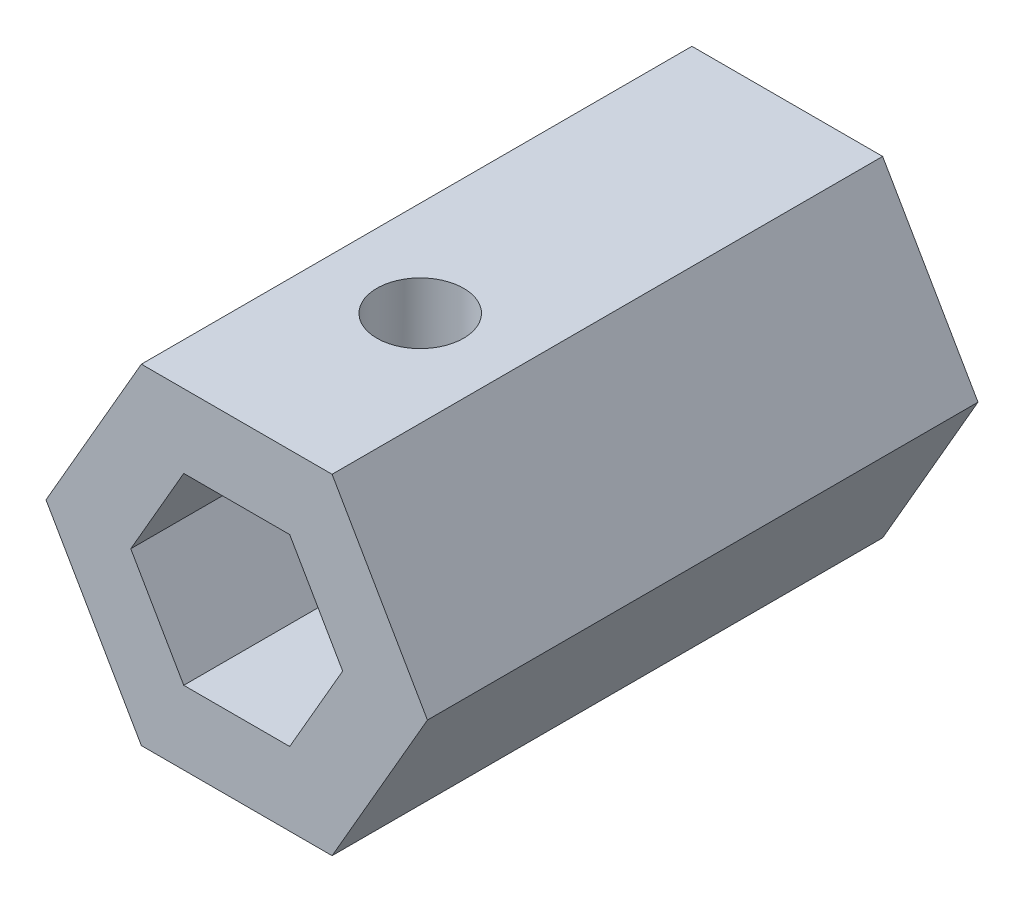
ISO-10303-21;
HEADER;
FILE_DESCRIPTION(('STEP AP214'),'2;1');
FILE_NAME('part.step','',(''),(''),'','','');
FILE_SCHEMA(('AUTOMOTIVE_DESIGN { 1 0 10303 214 1 1 1 1 }'));
ENDSEC;
DATA;
#1=APPLICATION_CONTEXT('core data for automotive mechanical design processes');
#2=APPLICATION_PROTOCOL_DEFINITION('international standard','automotive_design',2000,#1);
#3=PRODUCT_CONTEXT('',#1,'mechanical');
#4=PRODUCT('Part','Part','',(#3));
#5=PRODUCT_RELATED_PRODUCT_CATEGORY('part','',(#4));
#6=PRODUCT_DEFINITION_FORMATION('','',#4);
#7=PRODUCT_DEFINITION_CONTEXT('part definition',#1,'design');
#8=PRODUCT_DEFINITION('design','',#6,#7);
#9=PRODUCT_DEFINITION_SHAPE('','',#8);
#10=(LENGTH_UNIT() NAMED_UNIT(*) SI_UNIT(.MILLI.,.METRE.));
#11=(NAMED_UNIT(*) PLANE_ANGLE_UNIT() SI_UNIT($,.RADIAN.));
#12=(NAMED_UNIT(*) SI_UNIT($,.STERADIAN.) SOLID_ANGLE_UNIT());
#13=UNCERTAINTY_MEASURE_WITH_UNIT(LENGTH_MEASURE(1.E-05),#10,'distance_accuracy_value','');
#14=(GEOMETRIC_REPRESENTATION_CONTEXT(3) GLOBAL_UNCERTAINTY_ASSIGNED_CONTEXT((#13)) GLOBAL_UNIT_ASSIGNED_CONTEXT((#10,
#11,#12)) REPRESENTATION_CONTEXT('',''));
#15=CARTESIAN_POINT('',(0.,0.,0.));
#16=DIRECTION('',(0.,0.,1.));
#17=DIRECTION('',(1.,0.,0.));
#18=AXIS2_PLACEMENT_3D('',#15,#16,#17);
#19=CARTESIAN_POINT('',(0.,0.,0.));
#20=DIRECTION('',(0.,0.,1.));
#21=DIRECTION('',(1.,0.,0.));
#22=AXIS2_PLACEMENT_3D('',#19,#20,#21);
#23=PLANE('',#22);
#24=CARTESIAN_POINT('',(0.,0.,0.));
#25=DIRECTION('',(0.,0.,1.));
#26=DIRECTION('',(1.,0.,0.));
#27=AXIS2_PLACEMENT_3D('',#24,#25,#26);
#28=CIRCLE('',#27,2.2479);
#29=CARTESIAN_POINT('',(2.2479,0.,0.));
#30=VERTEX_POINT('',#29);
#31=EDGE_CURVE('E289',#30,#30,#28,.T.);
#32=ORIENTED_EDGE('',*,*,#31,.T.);
#33=EDGE_LOOP('',(#32));
#34=FACE_BOUND('',#33,.T.);
#35=CARTESIAN_POINT('',(0.,0.,0.));
#36=DIRECTION('',(0.,0.,-1.));
#37=DIRECTION('',(-1.,0.,0.));
#38=AXIS2_PLACEMENT_3D('',#35,#36,#37);
#39=CIRCLE('',#38,6.05);
#40=CARTESIAN_POINT('',(-6.05,0.,0.));
#41=VERTEX_POINT('',#40);
#42=EDGE_CURVE('E167',#41,#41,#39,.T.);
#43=ORIENTED_EDGE('',*,*,#42,.T.);
#44=EDGE_LOOP('',(#43));
#45=FACE_BOUND('',#44,.T.);
#46=ADVANCED_FACE('F51',(#34,#45),#23,.F.);
#47=CARTESIAN_POINT('',(9.89867036525614,-5.715,2.54));
#48=DIRECTION('',(-0.866025403784439,0.5,0.));
#49=DIRECTION('',(-0.5,-0.866025403784439,0.));
#50=AXIS2_PLACEMENT_3D('',#47,#48,#49);
#51=PLANE('',#50);
#52=DIRECTION('',(0.,0.,-1.));
#53=VECTOR('',#52,1.);
#54=CARTESIAN_POINT('',(6.59911357683742,-11.43,2.54));
#55=LINE('',#54,#53);
#56=CARTESIAN_POINT('',(6.59911357683742,-11.43,25.4));
#57=VERTEX_POINT('',#56);
#58=CARTESIAN_POINT('',(6.59911357683742,-11.43,-12.7));
#59=VERTEX_POINT('',#58);
#60=EDGE_CURVE('E149',#57,#59,#55,.T.);
#61=ORIENTED_EDGE('',*,*,#60,.T.);
#62=DIRECTION('',(-0.5,-0.866025403784439,0.));
#63=VECTOR('',#62,1.);
#64=CARTESIAN_POINT('',(13.1982271536748,0.,-12.7));
#65=LINE('',#64,#63);
#66=CARTESIAN_POINT('',(13.1982271536748,0.,-12.7));
#67=VERTEX_POINT('',#66);
#68=EDGE_CURVE('E148',#67,#59,#65,.T.);
#69=ORIENTED_EDGE('',*,*,#68,.F.);
#70=DIRECTION('',(0.,0.,-1.));
#71=VECTOR('',#70,1.);
#72=CARTESIAN_POINT('',(13.1982271536748,0.,2.54));
#73=LINE('',#72,#71);
#74=CARTESIAN_POINT('',(13.1982271536748,0.,25.4));
#75=VERTEX_POINT('',#74);
#76=EDGE_CURVE('E11',#75,#67,#73,.T.);
#77=ORIENTED_EDGE('',*,*,#76,.F.);
#78=DIRECTION('',(0.5,0.866025403784439,0.));
#79=VECTOR('',#78,1.);
#80=CARTESIAN_POINT('',(6.59911357683742,-11.43,25.4));
#81=LINE('',#80,#79);
#82=EDGE_CURVE('E259',#57,#75,#81,.T.);
#83=ORIENTED_EDGE('',*,*,#82,.F.);
#84=EDGE_LOOP('',(#61,#69,#77,#83));
#85=FACE_BOUND('',#84,.T.);
#86=ADVANCED_FACE('F53',(#85),#51,.F.);
#87=CARTESIAN_POINT('',(9.89867036525613,5.715,2.54));
#88=DIRECTION('',(-0.866025403784439,-0.5,0.));
#89=DIRECTION('',(0.5,-0.866025403784439,0.));
#90=AXIS2_PLACEMENT_3D('',#87,#88,#89);
#91=PLANE('',#90);
#92=ORIENTED_EDGE('',*,*,#76,.T.);
#93=DIRECTION('',(0.5,-0.866025403784439,0.));
#94=VECTOR('',#93,1.);
#95=CARTESIAN_POINT('',(6.59911357683742,11.43,-12.7));
#96=LINE('',#95,#94);
#97=CARTESIAN_POINT('',(6.59911357683742,11.43,-12.7));
#98=VERTEX_POINT('',#97);
#99=EDGE_CURVE('E141',#98,#67,#96,.T.);
#100=ORIENTED_EDGE('',*,*,#99,.F.);
#101=DIRECTION('',(0.,0.,-1.));
#102=VECTOR('',#101,1.);
#103=CARTESIAN_POINT('',(6.59911357683742,11.43,2.54));
#104=LINE('',#103,#102);
#105=CARTESIAN_POINT('',(6.59911357683742,11.43,25.4));
#106=VERTEX_POINT('',#105);
#107=EDGE_CURVE('E60',#106,#98,#104,.T.);
#108=ORIENTED_EDGE('',*,*,#107,.F.);
#109=DIRECTION('',(-0.5,0.866025403784439,0.));
#110=VECTOR('',#109,1.);
#111=CARTESIAN_POINT('',(13.1982271536748,0.,25.4));
#112=LINE('',#111,#110);
#113=EDGE_CURVE('E143',#75,#106,#112,.T.);
#114=ORIENTED_EDGE('',*,*,#113,.F.);
#115=EDGE_LOOP('',(#92,#100,#108,#114));
#116=FACE_BOUND('',#115,.T.);
#117=ADVANCED_FACE('F139',(#116),#91,.F.);
#118=CARTESIAN_POINT('',(0.,11.43,2.54));
#119=DIRECTION('',(0.,-1.,0.));
#120=DIRECTION('',(0.,0.,-1.));
#121=AXIS2_PLACEMENT_3D('',#118,#119,#120);
#122=PLANE('',#121);
#123=CARTESIAN_POINT('',(0.,11.43,12.7));
#124=DIRECTION('',(0.,1.,0.));
#125=DIRECTION('',(0.,0.,1.));
#126=AXIS2_PLACEMENT_3D('',#123,#124,#125);
#127=CIRCLE('',#126,3.);
#128=CARTESIAN_POINT('',(0.,11.43,15.7));
#129=VERTEX_POINT('',#128);
#130=EDGE_CURVE('E182',#129,#129,#127,.T.);
#131=ORIENTED_EDGE('',*,*,#130,.F.);
#132=EDGE_LOOP('',(#131));
#133=FACE_BOUND('',#132,.T.);
#134=ORIENTED_EDGE('',*,*,#107,.T.);
#135=DIRECTION('',(1.,0.,0.));
#136=VECTOR('',#135,1.);
#137=CARTESIAN_POINT('',(-6.59911357683742,11.43,-12.7));
#138=LINE('',#137,#136);
#139=CARTESIAN_POINT('',(-6.59911357683742,11.43,-12.7));
#140=VERTEX_POINT('',#139);
#141=EDGE_CURVE('E161',#140,#98,#138,.T.);
#142=ORIENTED_EDGE('',*,*,#141,.F.);
#143=DIRECTION('',(0.,0.,-1.));
#144=VECTOR('',#143,1.);
#145=CARTESIAN_POINT('',(-6.59911357683742,11.43,2.54));
#146=LINE('',#145,#144);
#147=CARTESIAN_POINT('',(-6.59911357683742,11.43,25.4));
#148=VERTEX_POINT('',#147);
#149=EDGE_CURVE('E301',#148,#140,#146,.T.);
#150=ORIENTED_EDGE('',*,*,#149,.F.);
#151=DIRECTION('',(-1.,0.,0.));
#152=VECTOR('',#151,1.);
#153=CARTESIAN_POINT('',(6.59911357683742,11.43,25.4));
#154=LINE('',#153,#152);
#155=EDGE_CURVE('E243',#106,#148,#154,.T.);
#156=ORIENTED_EDGE('',*,*,#155,.F.);
#157=EDGE_LOOP('',(#134,#142,#150,#156));
#158=FACE_BOUND('',#157,.T.);
#159=ADVANCED_FACE('F306',(#133,#158),#122,.F.);
#160=CARTESIAN_POINT('',(-9.89867036525613,5.715,2.54));
#161=DIRECTION('',(0.866025403784439,-0.5,0.));
#162=DIRECTION('',(0.5,0.866025403784439,0.));
#163=AXIS2_PLACEMENT_3D('',#160,#161,#162);
#164=PLANE('',#163);
#165=ORIENTED_EDGE('',*,*,#149,.T.);
#166=DIRECTION('',(0.5,0.866025403784439,0.));
#167=VECTOR('',#166,1.);
#168=CARTESIAN_POINT('',(-13.1982271536748,0.,-12.7));
#169=LINE('',#168,#167);
#170=CARTESIAN_POINT('',(-13.1982271536748,0.,-12.7));
#171=VERTEX_POINT('',#170);
#172=EDGE_CURVE('E177',#171,#140,#169,.T.);
#173=ORIENTED_EDGE('',*,*,#172,.F.);
#174=DIRECTION('',(0.,0.,-1.));
#175=VECTOR('',#174,1.);
#176=CARTESIAN_POINT('',(-13.1982271536748,0.,2.54));
#177=LINE('',#176,#175);
#178=CARTESIAN_POINT('',(-13.1982271536748,0.,25.4));
#179=VERTEX_POINT('',#178);
#180=EDGE_CURVE('E298',#179,#171,#177,.T.);
#181=ORIENTED_EDGE('',*,*,#180,.F.);
#182=DIRECTION('',(-0.5,-0.866025403784439,0.));
#183=VECTOR('',#182,1.);
#184=CARTESIAN_POINT('',(-6.59911357683742,11.43,25.4));
#185=LINE('',#184,#183);
#186=EDGE_CURVE('E247',#148,#179,#185,.T.);
#187=ORIENTED_EDGE('',*,*,#186,.F.);
#188=EDGE_LOOP('',(#165,#173,#181,#187));
#189=FACE_BOUND('',#188,.T.);
#190=ADVANCED_FACE('F320',(#189),#164,.F.);
#191=CARTESIAN_POINT('',(-9.89867036525613,-5.715,2.54));
#192=DIRECTION('',(0.866025403784439,0.5,0.));
#193=DIRECTION('',(-0.5,0.866025403784439,0.));
#194=AXIS2_PLACEMENT_3D('',#191,#192,#193);
#195=PLANE('',#194);
#196=ORIENTED_EDGE('',*,*,#180,.T.);
#197=DIRECTION('',(-0.5,0.866025403784439,0.));
#198=VECTOR('',#197,1.);
#199=CARTESIAN_POINT('',(-6.59911357683742,-11.43,-12.7));
#200=LINE('',#199,#198);
#201=CARTESIAN_POINT('',(-6.59911357683742,-11.43,-12.7));
#202=VERTEX_POINT('',#201);
#203=EDGE_CURVE('E173',#202,#171,#200,.T.);
#204=ORIENTED_EDGE('',*,*,#203,.F.);
#205=DIRECTION('',(0.,0.,-1.));
#206=VECTOR('',#205,1.);
#207=CARTESIAN_POINT('',(-6.59911357683742,-11.43,2.54));
#208=LINE('',#207,#206);
#209=CARTESIAN_POINT('',(-6.59911357683742,-11.43,25.4));
#210=VERTEX_POINT('',#209);
#211=EDGE_CURVE('E295',#210,#202,#208,.T.);
#212=ORIENTED_EDGE('',*,*,#211,.F.);
#213=DIRECTION('',(0.5,-0.866025403784439,0.));
#214=VECTOR('',#213,1.);
#215=CARTESIAN_POINT('',(-13.1982271536748,0.,25.4));
#216=LINE('',#215,#214);
#217=EDGE_CURVE('E251',#179,#210,#216,.T.);
#218=ORIENTED_EDGE('',*,*,#217,.F.);
#219=EDGE_LOOP('',(#196,#204,#212,#218));
#220=FACE_BOUND('',#219,.T.);
#221=ADVANCED_FACE('F318',(#220),#195,.F.);
#222=CARTESIAN_POINT('',(0.,-11.43,2.54));
#223=DIRECTION('',(0.,1.,0.));
#224=DIRECTION('',(0.,0.,1.));
#225=AXIS2_PLACEMENT_3D('',#222,#223,#224);
#226=PLANE('',#225);
#227=CARTESIAN_POINT('',(0.,-11.43,12.7));
#228=DIRECTION('',(0.,1.,0.));
#229=DIRECTION('',(0.,0.,1.));
#230=AXIS2_PLACEMENT_3D('',#227,#228,#229);
#231=CIRCLE('',#230,2.99999999999999);
#232=CARTESIAN_POINT('',(0.,-11.43,15.7));
#233=VERTEX_POINT('',#232);
#234=EDGE_CURVE('E186',#233,#233,#231,.T.);
#235=ORIENTED_EDGE('',*,*,#234,.T.);
#236=EDGE_LOOP('',(#235));
#237=FACE_BOUND('',#236,.T.);
#238=ORIENTED_EDGE('',*,*,#211,.T.);
#239=DIRECTION('',(-1.,0.,0.));
#240=VECTOR('',#239,1.);
#241=CARTESIAN_POINT('',(6.59911357683742,-11.43,-12.7));
#242=LINE('',#241,#240);
#243=EDGE_CURVE('E154',#59,#202,#242,.T.);
#244=ORIENTED_EDGE('',*,*,#243,.F.);
#245=ORIENTED_EDGE('',*,*,#60,.F.);
#246=DIRECTION('',(1.,0.,0.));
#247=VECTOR('',#246,1.);
#248=CARTESIAN_POINT('',(-6.59911357683742,-11.43,25.4));
#249=LINE('',#248,#247);
#250=EDGE_CURVE('E255',#210,#57,#249,.T.);
#251=ORIENTED_EDGE('',*,*,#250,.F.);
#252=EDGE_LOOP('',(#238,#244,#245,#251));
#253=FACE_BOUND('',#252,.T.);
#254=ADVANCED_FACE('F314',(#237,#253),#226,.F.);
#255=CARTESIAN_POINT('',(0.,0.,2.54));
#256=DIRECTION('',(0.,0.,1.));
#257=DIRECTION('',(1.,0.,0.));
#258=AXIS2_PLACEMENT_3D('',#255,#256,#257);
#259=PLANE('',#258);
#260=DIRECTION('',(-1.,0.,0.));
#261=VECTOR('',#260,1.);
#262=CARTESIAN_POINT('',(0.,-6.35,2.54));
#263=LINE('',#262,#261);
#264=CARTESIAN_POINT('',(3.66617420935413,-6.35,2.54));
#265=VERTEX_POINT('',#264);
#266=CARTESIAN_POINT('',(-3.66617420935412,-6.35,2.54));
#267=VERTEX_POINT('',#266);
#268=EDGE_CURVE('E67',#265,#267,#263,.T.);
#269=ORIENTED_EDGE('',*,*,#268,.F.);
#270=DIRECTION('',(-0.5,-0.866025403784439,0.));
#271=VECTOR('',#270,1.);
#272=CARTESIAN_POINT('',(5.49926131403119,-3.175,2.54));
#273=LINE('',#272,#271);
#274=CARTESIAN_POINT('',(7.33234841870825,0.,2.54));
#275=VERTEX_POINT('',#274);
#276=EDGE_CURVE('E71',#275,#265,#273,.T.);
#277=ORIENTED_EDGE('',*,*,#276,.F.);
#278=DIRECTION('',(0.5,-0.866025403784439,0.));
#279=VECTOR('',#278,1.);
#280=CARTESIAN_POINT('',(5.49926131403119,3.175,2.54));
#281=LINE('',#280,#279);
#282=CARTESIAN_POINT('',(3.66617420935412,6.35,2.54));
#283=VERTEX_POINT('',#282);
#284=EDGE_CURVE('E274',#283,#275,#281,.T.);
#285=ORIENTED_EDGE('',*,*,#284,.F.);
#286=DIRECTION('',(1.,0.,0.));
#287=VECTOR('',#286,1.);
#288=CARTESIAN_POINT('',(0.,6.35,2.54));
#289=LINE('',#288,#287);
#290=CARTESIAN_POINT('',(-3.66617420935412,6.35,2.54));
#291=VERTEX_POINT('',#290);
#292=EDGE_CURVE('E270',#291,#283,#289,.T.);
#293=ORIENTED_EDGE('',*,*,#292,.F.);
#294=DIRECTION('',(0.5,0.866025403784439,0.));
#295=VECTOR('',#294,1.);
#296=CARTESIAN_POINT('',(-5.49926131403118,3.175,2.54));
#297=LINE('',#296,#295);
#298=CARTESIAN_POINT('',(-7.33234841870825,0.,2.54));
#299=VERTEX_POINT('',#298);
#300=EDGE_CURVE('E266',#299,#291,#297,.T.);
#301=ORIENTED_EDGE('',*,*,#300,.F.);
#302=DIRECTION('',(-0.5,0.866025403784439,0.));
#303=VECTOR('',#302,1.);
#304=CARTESIAN_POINT('',(-5.49926131403119,-3.175,2.54));
#305=LINE('',#304,#303);
#306=EDGE_CURVE('E262',#267,#299,#305,.T.);
#307=ORIENTED_EDGE('',*,*,#306,.F.);
#308=EDGE_LOOP('',(#269,#277,#285,#293,#301,#307));
#309=FACE_BOUND('',#308,.T.);
#310=CARTESIAN_POINT('',(0.,0.,2.54));
#311=DIRECTION('',(0.,0.,1.));
#312=DIRECTION('',(1.,0.,0.));
#313=AXIS2_PLACEMENT_3D('',#310,#311,#312);
#314=CIRCLE('',#313,4.2164);
#315=CARTESIAN_POINT('',(4.2164,0.,2.54));
#316=VERTEX_POINT('',#315);
#317=EDGE_CURVE('E281',#316,#316,#314,.T.);
#318=ORIENTED_EDGE('',*,*,#317,.F.);
#319=EDGE_LOOP('',(#318));
#320=FACE_BOUND('',#319,.T.);
#321=ADVANCED_FACE('F340',(#309,#320),#259,.T.);
#322=CARTESIAN_POINT('',(0.,0.,2.54));
#323=DIRECTION('',(0.,0.,1.));
#324=DIRECTION('',(1.,0.,0.));
#325=AXIS2_PLACEMENT_3D('',#322,#323,#324);
#326=CYLINDRICAL_SURFACE('',#325,2.2479);
#327=ORIENTED_EDGE('',*,*,#31,.F.);
#328=EDGE_LOOP('',(#327));
#329=FACE_BOUND('',#328,.T.);
#330=CARTESIAN_POINT('',(0.,0.,0.888232376027522));
#331=DIRECTION('',(0.,0.,1.));
#332=DIRECTION('',(1.,0.,0.));
#333=AXIS2_PLACEMENT_3D('',#330,#331,#332);
#334=CIRCLE('',#333,2.2479);
#335=CARTESIAN_POINT('',(2.2479,0.,0.888232376027522));
#336=VERTEX_POINT('',#335);
#337=EDGE_CURVE('E285',#336,#336,#334,.T.);
#338=ORIENTED_EDGE('',*,*,#337,.T.);
#339=EDGE_LOOP('',(#338));
#340=FACE_BOUND('',#339,.T.);
#341=ADVANCED_FACE('F348',(#329,#340),#326,.F.);
#342=CARTESIAN_POINT('',(0.,0.,2.54));
#343=DIRECTION('',(0.,0.,1.));
#344=DIRECTION('',(1.,0.,0.));
#345=AXIS2_PLACEMENT_3D('',#342,#343,#344);
#346=CONICAL_SURFACE('',#345,4.2164,0.872664625997164);
#347=ORIENTED_EDGE('',*,*,#337,.F.);
#348=EDGE_LOOP('',(#347));
#349=FACE_BOUND('',#348,.T.);
#350=ORIENTED_EDGE('',*,*,#317,.T.);
#351=EDGE_LOOP('',(#350));
#352=FACE_BOUND('',#351,.T.);
#353=ADVANCED_FACE('F391',(#349,#352),#346,.F.);
#354=CARTESIAN_POINT('',(0.,0.,25.4));
#355=DIRECTION('',(0.,0.,1.));
#356=DIRECTION('',(1.,0.,0.));
#357=AXIS2_PLACEMENT_3D('',#354,#355,#356);
#358=PLANE('',#357);
#359=ORIENTED_EDGE('',*,*,#113,.T.);
#360=ORIENTED_EDGE('',*,*,#155,.T.);
#361=ORIENTED_EDGE('',*,*,#186,.T.);
#362=ORIENTED_EDGE('',*,*,#217,.T.);
#363=ORIENTED_EDGE('',*,*,#250,.T.);
#364=ORIENTED_EDGE('',*,*,#82,.T.);
#365=EDGE_LOOP('',(#359,#360,#361,#362,#363,#364));
#366=FACE_BOUND('',#365,.T.);
#367=DIRECTION('',(0.5,0.866025403784439,0.));
#368=VECTOR('',#367,1.);
#369=CARTESIAN_POINT('',(3.66617420935413,-6.35,25.4));
#370=LINE('',#369,#368);
#371=CARTESIAN_POINT('',(3.66617420935413,-6.35,25.4));
#372=VERTEX_POINT('',#371);
#373=CARTESIAN_POINT('',(7.33234841870825,0.,25.4));
#374=VERTEX_POINT('',#373);
#375=EDGE_CURVE('E201',#372,#374,#370,.T.);
#376=ORIENTED_EDGE('',*,*,#375,.F.);
#377=DIRECTION('',(1.,0.,0.));
#378=VECTOR('',#377,1.);
#379=CARTESIAN_POINT('',(-3.66617420935412,-6.35,25.4));
#380=LINE('',#379,#378);
#381=CARTESIAN_POINT('',(-3.66617420935412,-6.35,25.4));
#382=VERTEX_POINT('',#381);
#383=EDGE_CURVE('E198',#382,#372,#380,.T.);
#384=ORIENTED_EDGE('',*,*,#383,.F.);
#385=DIRECTION('',(0.5,-0.866025403784439,0.));
#386=VECTOR('',#385,1.);
#387=CARTESIAN_POINT('',(-7.33234841870825,0.,25.4));
#388=LINE('',#387,#386);
#389=CARTESIAN_POINT('',(-7.33234841870825,0.,25.4));
#390=VERTEX_POINT('',#389);
#391=EDGE_CURVE('E214',#390,#382,#388,.T.);
#392=ORIENTED_EDGE('',*,*,#391,.F.);
#393=DIRECTION('',(-0.5,-0.866025403784439,0.));
#394=VECTOR('',#393,1.);
#395=CARTESIAN_POINT('',(-3.66617420935412,6.35,25.4));
#396=LINE('',#395,#394);
#397=CARTESIAN_POINT('',(-3.66617420935412,6.35,25.4));
#398=VERTEX_POINT('',#397);
#399=EDGE_CURVE('E210',#398,#390,#396,.T.);
#400=ORIENTED_EDGE('',*,*,#399,.F.);
#401=DIRECTION('',(-1.,0.,0.));
#402=VECTOR('',#401,1.);
#403=CARTESIAN_POINT('',(3.66617420935412,6.35,25.4));
#404=LINE('',#403,#402);
#405=CARTESIAN_POINT('',(3.66617420935412,6.35,25.4));
#406=VERTEX_POINT('',#405);
#407=EDGE_CURVE('E207',#406,#398,#404,.T.);
#408=ORIENTED_EDGE('',*,*,#407,.F.);
#409=DIRECTION('',(-0.5,0.866025403784439,0.));
#410=VECTOR('',#409,1.);
#411=CARTESIAN_POINT('',(7.33234841870825,0.,25.4));
#412=LINE('',#411,#410);
#413=EDGE_CURVE('E204',#374,#406,#412,.T.);
#414=ORIENTED_EDGE('',*,*,#413,.F.);
#415=EDGE_LOOP('',(#376,#384,#392,#400,#408,#414));
#416=FACE_BOUND('',#415,.T.);
#417=ADVANCED_FACE('F309',(#366,#416),#358,.T.);
#418=CARTESIAN_POINT('',(-3.66617420935412,-6.35,25.4));
#419=DIRECTION('',(0.,1.,0.));
#420=DIRECTION('',(-1.,0.,0.));
#421=AXIS2_PLACEMENT_3D('',#418,#419,#420);
#422=PLANE('',#421);
#423=CARTESIAN_POINT('',(0.,-6.35,12.7));
#424=DIRECTION('',(0.,1.,0.));
#425=DIRECTION('',(-1.,0.,0.));
#426=AXIS2_PLACEMENT_3D('',#423,#424,#425);
#427=CIRCLE('',#426,3.);
#428=CARTESIAN_POINT('',(-2.99999999999999,-6.35,12.7));
#429=VERTEX_POINT('',#428);
#430=EDGE_CURVE('E194',#429,#429,#427,.T.);
#431=ORIENTED_EDGE('',*,*,#430,.F.);
#432=EDGE_LOOP('',(#431));
#433=FACE_BOUND('',#432,.T.);
#434=DIRECTION('',(0.,0.,-1.));
#435=VECTOR('',#434,1.);
#436=CARTESIAN_POINT('',(3.66617420935413,-6.35,25.4));
#437=LINE('',#436,#435);
#438=EDGE_CURVE('E237',#372,#265,#437,.T.);
#439=ORIENTED_EDGE('',*,*,#438,.T.);
#440=ORIENTED_EDGE('',*,*,#268,.T.);
#441=DIRECTION('',(0.,0.,-1.));
#442=VECTOR('',#441,1.);
#443=CARTESIAN_POINT('',(-3.66617420935412,-6.35,25.4));
#444=LINE('',#443,#442);
#445=EDGE_CURVE('E217',#382,#267,#444,.T.);
#446=ORIENTED_EDGE('',*,*,#445,.F.);
#447=ORIENTED_EDGE('',*,*,#383,.T.);
#448=EDGE_LOOP('',(#439,#440,#446,#447));
#449=FACE_BOUND('',#448,.T.);
#450=ADVANCED_FACE('F384',(#433,#449),#422,.T.);
#451=CARTESIAN_POINT('',(3.66617420935413,-6.35,25.4));
#452=DIRECTION('',(-0.866025403784439,0.5,0.));
#453=DIRECTION('',(-0.5,-0.866025403784439,0.));
#454=AXIS2_PLACEMENT_3D('',#451,#452,#453);
#455=PLANE('',#454);
#456=DIRECTION('',(0.,0.,-1.));
#457=VECTOR('',#456,1.);
#458=CARTESIAN_POINT('',(7.33234841870825,0.,25.4));
#459=LINE('',#458,#457);
#460=EDGE_CURVE('E233',#374,#275,#459,.T.);
#461=ORIENTED_EDGE('',*,*,#460,.T.);
#462=ORIENTED_EDGE('',*,*,#276,.T.);
#463=ORIENTED_EDGE('',*,*,#438,.F.);
#464=ORIENTED_EDGE('',*,*,#375,.T.);
#465=EDGE_LOOP('',(#461,#462,#463,#464));
#466=FACE_BOUND('',#465,.T.);
#467=ADVANCED_FACE('F380',(#466),#455,.T.);
#468=CARTESIAN_POINT('',(7.33234841870825,0.,25.4));
#469=DIRECTION('',(-0.866025403784439,-0.5,0.));
#470=DIRECTION('',(0.5,-0.866025403784439,0.));
#471=AXIS2_PLACEMENT_3D('',#468,#469,#470);
#472=PLANE('',#471);
#473=DIRECTION('',(0.,0.,-1.));
#474=VECTOR('',#473,1.);
#475=CARTESIAN_POINT('',(3.66617420935412,6.35,25.4));
#476=LINE('',#475,#474);
#477=EDGE_CURVE('E229',#406,#283,#476,.T.);
#478=ORIENTED_EDGE('',*,*,#477,.T.);
#479=ORIENTED_EDGE('',*,*,#284,.T.);
#480=ORIENTED_EDGE('',*,*,#460,.F.);
#481=ORIENTED_EDGE('',*,*,#413,.T.);
#482=EDGE_LOOP('',(#478,#479,#480,#481));
#483=FACE_BOUND('',#482,.T.);
#484=ADVANCED_FACE('F376',(#483),#472,.T.);
#485=CARTESIAN_POINT('',(3.66617420935412,6.35,25.4));
#486=DIRECTION('',(0.,-1.,0.));
#487=DIRECTION('',(0.,0.,-1.));
#488=AXIS2_PLACEMENT_3D('',#485,#486,#487);
#489=PLANE('',#488);
#490=CARTESIAN_POINT('',(0.,6.35,12.7));
#491=DIRECTION('',(0.,-1.,0.));
#492=DIRECTION('',(0.,0.,-1.));
#493=AXIS2_PLACEMENT_3D('',#490,#491,#492);
#494=CIRCLE('',#493,3.);
#495=CARTESIAN_POINT('',(0.,6.35,9.7));
#496=VERTEX_POINT('',#495);
#497=EDGE_CURVE('E190',#496,#496,#494,.T.);
#498=ORIENTED_EDGE('',*,*,#497,.F.);
#499=EDGE_LOOP('',(#498));
#500=FACE_BOUND('',#499,.T.);
#501=DIRECTION('',(0.,0.,-1.));
#502=VECTOR('',#501,1.);
#503=CARTESIAN_POINT('',(-3.66617420935412,6.35,25.4));
#504=LINE('',#503,#502);
#505=EDGE_CURVE('E225',#398,#291,#504,.T.);
#506=ORIENTED_EDGE('',*,*,#505,.T.);
#507=ORIENTED_EDGE('',*,*,#292,.T.);
#508=ORIENTED_EDGE('',*,*,#477,.F.);
#509=ORIENTED_EDGE('',*,*,#407,.T.);
#510=EDGE_LOOP('',(#506,#507,#508,#509));
#511=FACE_BOUND('',#510,.T.);
#512=ADVANCED_FACE('F372',(#500,#511),#489,.T.);
#513=CARTESIAN_POINT('',(-3.66617420935412,6.35,25.4));
#514=DIRECTION('',(0.866025403784439,-0.5,0.));
#515=DIRECTION('',(0.5,0.866025403784439,0.));
#516=AXIS2_PLACEMENT_3D('',#513,#514,#515);
#517=PLANE('',#516);
#518=DIRECTION('',(0.,0.,-1.));
#519=VECTOR('',#518,1.);
#520=CARTESIAN_POINT('',(-7.33234841870825,0.,25.4));
#521=LINE('',#520,#519);
#522=EDGE_CURVE('E221',#390,#299,#521,.T.);
#523=ORIENTED_EDGE('',*,*,#522,.T.);
#524=ORIENTED_EDGE('',*,*,#300,.T.);
#525=ORIENTED_EDGE('',*,*,#505,.F.);
#526=ORIENTED_EDGE('',*,*,#399,.T.);
#527=EDGE_LOOP('',(#523,#524,#525,#526));
#528=FACE_BOUND('',#527,.T.);
#529=ADVANCED_FACE('F368',(#528),#517,.T.);
#530=CARTESIAN_POINT('',(-7.33234841870825,0.,25.4));
#531=DIRECTION('',(0.866025403784439,0.5,0.));
#532=DIRECTION('',(-0.5,0.866025403784439,0.));
#533=AXIS2_PLACEMENT_3D('',#530,#531,#532);
#534=PLANE('',#533);
#535=ORIENTED_EDGE('',*,*,#445,.T.);
#536=ORIENTED_EDGE('',*,*,#306,.T.);
#537=ORIENTED_EDGE('',*,*,#522,.F.);
#538=ORIENTED_EDGE('',*,*,#391,.T.);
#539=EDGE_LOOP('',(#535,#536,#537,#538));
#540=FACE_BOUND('',#539,.T.);
#541=ADVANCED_FACE('F362',(#540),#534,.T.);
#542=CARTESIAN_POINT('',(0.,11.43,12.7));
#543=DIRECTION('',(0.,1.,0.));
#544=DIRECTION('',(0.,0.,1.));
#545=AXIS2_PLACEMENT_3D('',#542,#543,#544);
#546=CYLINDRICAL_SURFACE('',#545,3.);
#547=ORIENTED_EDGE('',*,*,#497,.T.);
#548=EDGE_LOOP('',(#547));
#549=FACE_BOUND('',#548,.T.);
#550=ORIENTED_EDGE('',*,*,#130,.T.);
#551=EDGE_LOOP('',(#550));
#552=FACE_BOUND('',#551,.T.);
#553=ADVANCED_FACE('F353',(#549,#552),#546,.F.);
#554=ORIENTED_EDGE('',*,*,#430,.T.);
#555=EDGE_LOOP('',(#554));
#556=FACE_BOUND('',#555,.T.);
#557=ORIENTED_EDGE('',*,*,#234,.F.);
#558=EDGE_LOOP('',(#557));
#559=FACE_BOUND('',#558,.T.);
#560=ADVANCED_FACE('F351',(#556,#559),#546,.F.);
#561=CARTESIAN_POINT('',(0.,0.,-12.7));
#562=DIRECTION('',(0.,0.,-1.));
#563=DIRECTION('',(-1.,0.,0.));
#564=AXIS2_PLACEMENT_3D('',#561,#562,#563);
#565=PLANE('',#564);
#566=ORIENTED_EDGE('',*,*,#99,.T.);
#567=ORIENTED_EDGE('',*,*,#68,.T.);
#568=ORIENTED_EDGE('',*,*,#243,.T.);
#569=ORIENTED_EDGE('',*,*,#203,.T.);
#570=ORIENTED_EDGE('',*,*,#172,.T.);
#571=ORIENTED_EDGE('',*,*,#141,.T.);
#572=EDGE_LOOP('',(#566,#567,#568,#569,#570,#571));
#573=FACE_BOUND('',#572,.T.);
#574=CARTESIAN_POINT('',(0.,0.,-12.7));
#575=DIRECTION('',(0.,0.,-1.));
#576=DIRECTION('',(-1.,0.,0.));
#577=AXIS2_PLACEMENT_3D('',#574,#575,#576);
#578=CIRCLE('',#577,6.05);
#579=CARTESIAN_POINT('',(-6.05,0.,-12.7));
#580=VERTEX_POINT('',#579);
#581=EDGE_CURVE('E163',#580,#580,#578,.T.);
#582=ORIENTED_EDGE('',*,*,#581,.F.);
#583=EDGE_LOOP('',(#582));
#584=FACE_BOUND('',#583,.T.);
#585=ADVANCED_FACE('F157',(#573,#584),#565,.T.);
#586=CARTESIAN_POINT('',(0.,0.,-12.7));
#587=DIRECTION('',(0.,0.,1.));
#588=DIRECTION('',(1.,0.,0.));
#589=AXIS2_PLACEMENT_3D('',#586,#587,#588);
#590=CYLINDRICAL_SURFACE('',#589,6.05);
#591=ORIENTED_EDGE('',*,*,#581,.T.);
#592=EDGE_LOOP('',(#591));
#593=FACE_BOUND('',#592,.T.);
#594=ORIENTED_EDGE('',*,*,#42,.F.);
#595=EDGE_LOOP('',(#594));
#596=FACE_BOUND('',#595,.T.);
#597=ADVANCED_FACE('F359',(#593,#596),#590,.F.);
#598=CLOSED_SHELL('',(#46,#86,#117,#159,#190,#221,#254,#321,#341,#353,#417,#450,#467,#484,#512,
#529,#541,#553,#560,#585,#597));
#599=MANIFOLD_SOLID_BREP('B2',#598);
#600=ADVANCED_BREP_SHAPE_REPRESENTATION('',(#18,#599),#14);
#601=SHAPE_DEFINITION_REPRESENTATION(#9,#600);
ENDSEC;
END-ISO-10303-21;
